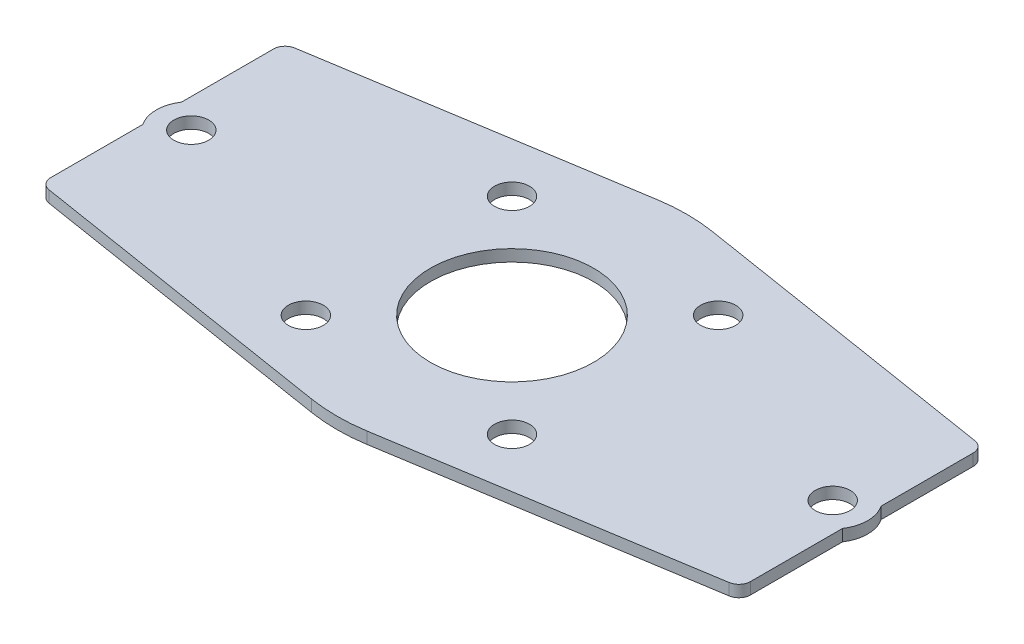
ISO-10303-21;
HEADER;
FILE_DESCRIPTION(('STEP AP214'),'2;1');
FILE_NAME('part.step','',(''),(''),'','','');
FILE_SCHEMA(('AUTOMOTIVE_DESIGN { 1 0 10303 214 1 1 1 1 }'));
ENDSEC;
DATA;
#1=APPLICATION_CONTEXT('core data for automotive mechanical design processes');
#2=APPLICATION_PROTOCOL_DEFINITION('international standard','automotive_design',2000,#1);
#3=PRODUCT_CONTEXT('',#1,'mechanical');
#4=PRODUCT('Part','Part','',(#3));
#5=PRODUCT_RELATED_PRODUCT_CATEGORY('part','',(#4));
#6=PRODUCT_DEFINITION_FORMATION('','',#4);
#7=PRODUCT_DEFINITION_CONTEXT('part definition',#1,'design');
#8=PRODUCT_DEFINITION('design','',#6,#7);
#9=PRODUCT_DEFINITION_SHAPE('','',#8);
#10=(LENGTH_UNIT() NAMED_UNIT(*) SI_UNIT(.MILLI.,.METRE.));
#11=(NAMED_UNIT(*) PLANE_ANGLE_UNIT() SI_UNIT($,.RADIAN.));
#12=(NAMED_UNIT(*) SI_UNIT($,.STERADIAN.) SOLID_ANGLE_UNIT());
#13=UNCERTAINTY_MEASURE_WITH_UNIT(LENGTH_MEASURE(1.E-05),#10,'distance_accuracy_value','');
#14=(GEOMETRIC_REPRESENTATION_CONTEXT(3) GLOBAL_UNCERTAINTY_ASSIGNED_CONTEXT((#13)) GLOBAL_UNIT_ASSIGNED_CONTEXT((#10,
#11,#12)) REPRESENTATION_CONTEXT('',''));
#15=CARTESIAN_POINT('',(0.,0.,0.));
#16=DIRECTION('',(0.,0.,1.));
#17=DIRECTION('',(1.,0.,0.));
#18=AXIS2_PLACEMENT_3D('',#15,#16,#17);
#19=CARTESIAN_POINT('',(0.,1.,0.));
#20=DIRECTION('',(0.,-1.,0.));
#21=DIRECTION('',(0.,0.,-1.));
#22=AXIS2_PLACEMENT_3D('',#19,#20,#21);
#23=CYLINDRICAL_SURFACE('',#22,15.);
#24=CARTESIAN_POINT('',(0.,0.,0.));
#25=DIRECTION('',(0.,1.,0.));
#26=DIRECTION('',(0.,0.,1.));
#27=AXIS2_PLACEMENT_3D('',#24,#25,#26);
#28=CIRCLE('',#27,15.);
#29=CARTESIAN_POINT('',(-2.36544142165045,0.,14.8123153787901));
#30=VERTEX_POINT('',#29);
#31=CARTESIAN_POINT('',(2.36544142165045,0.,14.8123153787901));
#32=VERTEX_POINT('',#31);
#33=EDGE_CURVE('E202',#30,#32,#28,.T.);
#34=ORIENTED_EDGE('',*,*,#33,.T.);
#35=DIRECTION('',(0.,-1.,0.));
#36=VECTOR('',#35,1.);
#37=CARTESIAN_POINT('',(2.36544142165045,1.,14.8123153787901));
#38=LINE('',#37,#36);
#39=CARTESIAN_POINT('',(2.36544142165045,1.,14.8123153787901));
#40=VERTEX_POINT('',#39);
#41=EDGE_CURVE('E11',#40,#32,#38,.T.);
#42=ORIENTED_EDGE('',*,*,#41,.F.);
#43=CARTESIAN_POINT('',(0.,1.,0.));
#44=DIRECTION('',(0.,1.,0.));
#45=DIRECTION('',(0.,0.,1.));
#46=AXIS2_PLACEMENT_3D('',#43,#44,#45);
#47=CIRCLE('',#46,15.);
#48=CARTESIAN_POINT('',(-2.36544142165045,1.,14.8123153787901));
#49=VERTEX_POINT('',#48);
#50=EDGE_CURVE('E116',#49,#40,#47,.T.);
#51=ORIENTED_EDGE('',*,*,#50,.F.);
#52=DIRECTION('',(0.,-1.,0.));
#53=VECTOR('',#52,1.);
#54=CARTESIAN_POINT('',(-2.36544142165045,1.,14.8123153787901));
#55=LINE('',#54,#53);
#56=EDGE_CURVE('E186',#49,#30,#55,.T.);
#57=ORIENTED_EDGE('',*,*,#56,.T.);
#58=EDGE_LOOP('',(#34,#42,#51,#57));
#59=FACE_BOUND('',#58,.T.);
#60=ADVANCED_FACE('F35',(#59),#23,.T.);
#61=CARTESIAN_POINT('',(2.36544142165045,1.,14.8123153787901));
#62=DIRECTION('',(0.157696094776696,0.,0.987487691919337));
#63=DIRECTION('',(0.987487691919337,0.,-0.157696094776696));
#64=AXIS2_PLACEMENT_3D('',#61,#62,#63);
#65=PLANE('',#64);
#66=DIRECTION('',(-0.987487691919337,0.,0.157696094776697));
#67=VECTOR('',#66,1.);
#68=CARTESIAN_POINT('',(2.36544142165045,0.,14.8123153787901));
#69=LINE('',#68,#67);
#70=CARTESIAN_POINT('',(29.1576960950391,0.,10.5337466767903));
#71=VERTEX_POINT('',#70);
#72=EDGE_CURVE('E205',#71,#32,#69,.T.);
#73=ORIENTED_EDGE('',*,*,#72,.F.);
#74=DIRECTION('',(0.,-1.,0.));
#75=VECTOR('',#74,1.);
#76=CARTESIAN_POINT('',(29.1576960950391,1.,10.5337466767903));
#77=LINE('',#76,#75);
#78=CARTESIAN_POINT('',(29.1576960950391,1.,10.5337466767903));
#79=VERTEX_POINT('',#78);
#80=EDGE_CURVE('E44',#79,#71,#77,.T.);
#81=ORIENTED_EDGE('',*,*,#80,.F.);
#82=DIRECTION('',(-0.987487691919337,0.,0.157696094776697));
#83=VECTOR('',#82,1.);
#84=CARTESIAN_POINT('',(2.36544142165045,1.,14.8123153787901));
#85=LINE('',#84,#83);
#86=EDGE_CURVE('E290',#79,#40,#85,.T.);
#87=ORIENTED_EDGE('',*,*,#86,.T.);
#88=ORIENTED_EDGE('',*,*,#41,.T.);
#89=EDGE_LOOP('',(#73,#81,#87,#88));
#90=FACE_BOUND('',#89,.T.);
#91=ADVANCED_FACE('F276',(#90),#65,.T.);
#92=CARTESIAN_POINT('',(29.0000000002624,1.,9.54625898487092));
#93=DIRECTION('',(0.,-1.,0.));
#94=DIRECTION('',(0.,0.,-1.));
#95=AXIS2_PLACEMENT_3D('',#92,#93,#94);
#96=CYLINDRICAL_SURFACE('',#95,1.);
#97=CARTESIAN_POINT('',(29.0000000002624,0.,9.54625898487092));
#98=DIRECTION('',(0.,1.,0.));
#99=DIRECTION('',(0.,0.,1.));
#100=AXIS2_PLACEMENT_3D('',#97,#98,#99);
#101=CIRCLE('',#100,1.);
#102=CARTESIAN_POINT('',(30.0000000002624,0.,9.54625898487092));
#103=VERTEX_POINT('',#102);
#104=EDGE_CURVE('E209',#103,#71,#101,.F.);
#105=ORIENTED_EDGE('',*,*,#104,.F.);
#106=DIRECTION('',(0.,-1.,0.));
#107=VECTOR('',#106,1.);
#108=CARTESIAN_POINT('',(30.0000000002624,1.,9.54625898487092));
#109=LINE('',#108,#107);
#110=CARTESIAN_POINT('',(30.0000000002624,1.,9.54625898487092));
#111=VERTEX_POINT('',#110);
#112=EDGE_CURVE('E266',#111,#103,#109,.T.);
#113=ORIENTED_EDGE('',*,*,#112,.F.);
#114=CARTESIAN_POINT('',(29.0000000002624,1.,9.54625898487092));
#115=DIRECTION('',(0.,1.,0.));
#116=DIRECTION('',(0.,0.,1.));
#117=AXIS2_PLACEMENT_3D('',#114,#115,#116);
#118=CIRCLE('',#117,1.);
#119=EDGE_CURVE('E273',#111,#79,#118,.F.);
#120=ORIENTED_EDGE('',*,*,#119,.T.);
#121=ORIENTED_EDGE('',*,*,#80,.T.);
#122=EDGE_LOOP('',(#105,#113,#120,#121));
#123=FACE_BOUND('',#122,.T.);
#124=ADVANCED_FACE('F271',(#123),#96,.T.);
#125=CARTESIAN_POINT('',(30.0000000002624,1.,0.));
#126=DIRECTION('',(1.,0.,0.));
#127=DIRECTION('',(0.,0.,-1.));
#128=AXIS2_PLACEMENT_3D('',#125,#126,#127);
#129=PLANE('',#128);
#130=DIRECTION('',(0.,0.,1.));
#131=VECTOR('',#130,1.);
#132=CARTESIAN_POINT('',(30.0000000002624,0.,0.));
#133=LINE('',#132,#131);
#134=CARTESIAN_POINT('',(30.0000000002624,0.,1.65831239478212));
#135=VERTEX_POINT('',#134);
#136=EDGE_CURVE('E212',#135,#103,#133,.T.);
#137=ORIENTED_EDGE('',*,*,#136,.F.);
#138=DIRECTION('',(0.,-1.,0.));
#139=VECTOR('',#138,1.);
#140=CARTESIAN_POINT('',(30.0000000002624,1.,1.65831239478212));
#141=LINE('',#140,#139);
#142=CARTESIAN_POINT('',(30.0000000002624,1.,1.65831239478212));
#143=VERTEX_POINT('',#142);
#144=EDGE_CURVE('E264',#143,#135,#141,.T.);
#145=ORIENTED_EDGE('',*,*,#144,.F.);
#146=DIRECTION('',(0.,0.,1.));
#147=VECTOR('',#146,1.);
#148=CARTESIAN_POINT('',(30.0000000002624,1.,0.));
#149=LINE('',#148,#147);
#150=EDGE_CURVE('E289',#143,#111,#149,.T.);
#151=ORIENTED_EDGE('',*,*,#150,.T.);
#152=ORIENTED_EDGE('',*,*,#112,.T.);
#153=EDGE_LOOP('',(#137,#145,#151,#152));
#154=FACE_BOUND('',#153,.T.);
#155=ADVANCED_FACE('F285',(#154),#129,.T.);
#156=CARTESIAN_POINT('',(27.5,1.,0.));
#157=DIRECTION('',(0.,-1.,0.));
#158=DIRECTION('',(0.,0.,-1.));
#159=AXIS2_PLACEMENT_3D('',#156,#157,#158);
#160=CYLINDRICAL_SURFACE('',#159,3.);
#161=CARTESIAN_POINT('',(27.5,0.,0.));
#162=DIRECTION('',(0.,1.,0.));
#163=DIRECTION('',(0.,0.,1.));
#164=AXIS2_PLACEMENT_3D('',#161,#162,#163);
#165=CIRCLE('',#164,3.);
#166=CARTESIAN_POINT('',(30.0000000002624,0.,-1.65831239478214));
#167=VERTEX_POINT('',#166);
#168=EDGE_CURVE('E215',#135,#167,#165,.T.);
#169=ORIENTED_EDGE('',*,*,#168,.T.);
#170=DIRECTION('',(0.,-1.,0.));
#171=VECTOR('',#170,1.);
#172=CARTESIAN_POINT('',(30.0000000002624,1.,-1.65831239478214));
#173=LINE('',#172,#171);
#174=CARTESIAN_POINT('',(30.0000000002624,1.,-1.65831239478214));
#175=VERTEX_POINT('',#174);
#176=EDGE_CURVE('E262',#175,#167,#173,.T.);
#177=ORIENTED_EDGE('',*,*,#176,.F.);
#178=CARTESIAN_POINT('',(27.5,1.,0.));
#179=DIRECTION('',(0.,1.,0.));
#180=DIRECTION('',(0.,0.,1.));
#181=AXIS2_PLACEMENT_3D('',#178,#179,#180);
#182=CIRCLE('',#181,3.);
#183=EDGE_CURVE('E292',#143,#175,#182,.T.);
#184=ORIENTED_EDGE('',*,*,#183,.F.);
#185=ORIENTED_EDGE('',*,*,#144,.T.);
#186=EDGE_LOOP('',(#169,#177,#184,#185));
#187=FACE_BOUND('',#186,.T.);
#188=ADVANCED_FACE('F437',(#187),#160,.T.);
#189=CARTESIAN_POINT('',(30.0000000002624,0.,-9.54625898487092));
#190=VERTEX_POINT('',#189);
#191=EDGE_CURVE('E216',#190,#167,#133,.T.);
#192=ORIENTED_EDGE('',*,*,#191,.F.);
#193=DIRECTION('',(0.,-1.,0.));
#194=VECTOR('',#193,1.);
#195=CARTESIAN_POINT('',(30.0000000002624,1.,-9.54625898487092));
#196=LINE('',#195,#194);
#197=CARTESIAN_POINT('',(30.0000000002624,1.,-9.54625898487092));
#198=VERTEX_POINT('',#197);
#199=EDGE_CURVE('E260',#198,#190,#196,.T.);
#200=ORIENTED_EDGE('',*,*,#199,.F.);
#201=EDGE_CURVE('E294',#198,#175,#149,.T.);
#202=ORIENTED_EDGE('',*,*,#201,.T.);
#203=ORIENTED_EDGE('',*,*,#176,.T.);
#204=EDGE_LOOP('',(#192,#200,#202,#203));
#205=FACE_BOUND('',#204,.T.);
#206=ADVANCED_FACE('F440',(#205),#129,.T.);
#207=CARTESIAN_POINT('',(29.0000000002624,1.,-9.54625898487092));
#208=DIRECTION('',(0.,-1.,0.));
#209=DIRECTION('',(0.,0.,-1.));
#210=AXIS2_PLACEMENT_3D('',#207,#208,#209);
#211=CYLINDRICAL_SURFACE('',#210,1.);
#212=CARTESIAN_POINT('',(29.0000000002624,0.,-9.54625898487092));
#213=DIRECTION('',(0.,1.,0.));
#214=DIRECTION('',(0.,0.,1.));
#215=AXIS2_PLACEMENT_3D('',#212,#213,#214);
#216=CIRCLE('',#215,1.);
#217=CARTESIAN_POINT('',(29.1576960950391,0.,-10.5337466767903));
#218=VERTEX_POINT('',#217);
#219=EDGE_CURVE('E219',#218,#190,#216,.F.);
#220=ORIENTED_EDGE('',*,*,#219,.F.);
#221=DIRECTION('',(0.,-1.,0.));
#222=VECTOR('',#221,1.);
#223=CARTESIAN_POINT('',(29.1576960950391,1.,-10.5337466767903));
#224=LINE('',#223,#222);
#225=CARTESIAN_POINT('',(29.1576960950391,1.,-10.5337466767903));
#226=VERTEX_POINT('',#225);
#227=EDGE_CURVE('E258',#226,#218,#224,.T.);
#228=ORIENTED_EDGE('',*,*,#227,.F.);
#229=CARTESIAN_POINT('',(29.0000000002624,1.,-9.54625898487092));
#230=DIRECTION('',(0.,1.,0.));
#231=DIRECTION('',(0.,0.,1.));
#232=AXIS2_PLACEMENT_3D('',#229,#230,#231);
#233=CIRCLE('',#232,1.);
#234=EDGE_CURVE('E299',#226,#198,#233,.F.);
#235=ORIENTED_EDGE('',*,*,#234,.T.);
#236=ORIENTED_EDGE('',*,*,#199,.T.);
#237=EDGE_LOOP('',(#220,#228,#235,#236));
#238=FACE_BOUND('',#237,.T.);
#239=ADVANCED_FACE('F355',(#238),#211,.T.);
#240=CARTESIAN_POINT('',(2.36544142165045,1.,-14.8123153787901));
#241=DIRECTION('',(-0.157696094776697,0.,0.987487691919337));
#242=DIRECTION('',(0.987487691919337,0.,0.157696094776697));
#243=AXIS2_PLACEMENT_3D('',#240,#241,#242);
#244=PLANE('',#243);
#245=DIRECTION('',(-0.987487691919337,0.,-0.157696094776697));
#246=VECTOR('',#245,1.);
#247=CARTESIAN_POINT('',(2.36544142165045,0.,-14.8123153787901));
#248=LINE('',#247,#246);
#249=CARTESIAN_POINT('',(2.36544142165045,0.,-14.8123153787901));
#250=VERTEX_POINT('',#249);
#251=EDGE_CURVE('E222',#218,#250,#248,.T.);
#252=ORIENTED_EDGE('',*,*,#251,.T.);
#253=DIRECTION('',(0.,-1.,0.));
#254=VECTOR('',#253,1.);
#255=CARTESIAN_POINT('',(2.36544142165045,1.,-14.8123153787901));
#256=LINE('',#255,#254);
#257=CARTESIAN_POINT('',(2.36544142165045,1.,-14.8123153787901));
#258=VERTEX_POINT('',#257);
#259=EDGE_CURVE('E255',#258,#250,#256,.T.);
#260=ORIENTED_EDGE('',*,*,#259,.F.);
#261=DIRECTION('',(-0.987487691919337,0.,-0.157696094776697));
#262=VECTOR('',#261,1.);
#263=CARTESIAN_POINT('',(2.36544142165045,1.,-14.8123153787901));
#264=LINE('',#263,#262);
#265=EDGE_CURVE('E302',#226,#258,#264,.T.);
#266=ORIENTED_EDGE('',*,*,#265,.F.);
#267=ORIENTED_EDGE('',*,*,#227,.T.);
#268=EDGE_LOOP('',(#252,#260,#266,#267));
#269=FACE_BOUND('',#268,.T.);
#270=ADVANCED_FACE('F347',(#269),#244,.F.);
#271=CARTESIAN_POINT('',(-2.36544142165045,0.,-14.8123153787901));
#272=VERTEX_POINT('',#271);
#273=EDGE_CURVE('E206',#250,#272,#28,.T.);
#274=ORIENTED_EDGE('',*,*,#273,.T.);
#275=DIRECTION('',(0.,-1.,0.));
#276=VECTOR('',#275,1.);
#277=CARTESIAN_POINT('',(-2.36544142165045,1.,-14.8123153787901));
#278=LINE('',#277,#276);
#279=CARTESIAN_POINT('',(-2.36544142165045,1.,-14.8123153787901));
#280=VERTEX_POINT('',#279);
#281=EDGE_CURVE('E253',#280,#272,#278,.T.);
#282=ORIENTED_EDGE('',*,*,#281,.F.);
#283=EDGE_CURVE('E304',#258,#280,#47,.T.);
#284=ORIENTED_EDGE('',*,*,#283,.F.);
#285=ORIENTED_EDGE('',*,*,#259,.T.);
#286=EDGE_LOOP('',(#274,#282,#284,#285));
#287=FACE_BOUND('',#286,.T.);
#288=ADVANCED_FACE('F338',(#287),#23,.T.);
#289=CARTESIAN_POINT('',(-2.36544142165045,1.,-14.8123153787901));
#290=DIRECTION('',(-0.157696094776697,0.,-0.987487691919337));
#291=DIRECTION('',(-0.987487691919337,0.,0.157696094776697));
#292=AXIS2_PLACEMENT_3D('',#289,#290,#291);
#293=PLANE('',#292);
#294=DIRECTION('',(0.987487691919337,0.,-0.157696094776697));
#295=VECTOR('',#294,1.);
#296=CARTESIAN_POINT('',(-2.36544142165045,0.,-14.8123153787901));
#297=LINE('',#296,#295);
#298=CARTESIAN_POINT('',(-29.1576960950391,0.,-10.5337466767903));
#299=VERTEX_POINT('',#298);
#300=EDGE_CURVE('E224',#299,#272,#297,.T.);
#301=ORIENTED_EDGE('',*,*,#300,.F.);
#302=DIRECTION('',(0.,-1.,0.));
#303=VECTOR('',#302,1.);
#304=CARTESIAN_POINT('',(-29.1576960950391,1.,-10.5337466767903));
#305=LINE('',#304,#303);
#306=CARTESIAN_POINT('',(-29.1576960950391,1.,-10.5337466767903));
#307=VERTEX_POINT('',#306);
#308=EDGE_CURVE('E251',#307,#299,#305,.T.);
#309=ORIENTED_EDGE('',*,*,#308,.F.);
#310=DIRECTION('',(0.987487691919337,0.,-0.157696094776697));
#311=VECTOR('',#310,1.);
#312=CARTESIAN_POINT('',(-2.36544142165045,1.,-14.8123153787901));
#313=LINE('',#312,#311);
#314=EDGE_CURVE('E305',#307,#280,#313,.T.);
#315=ORIENTED_EDGE('',*,*,#314,.T.);
#316=ORIENTED_EDGE('',*,*,#281,.T.);
#317=EDGE_LOOP('',(#301,#309,#315,#316));
#318=FACE_BOUND('',#317,.T.);
#319=ADVANCED_FACE('F346',(#318),#293,.T.);
#320=CARTESIAN_POINT('',(-29.0000000002624,1.,-9.54625898487092));
#321=DIRECTION('',(0.,-1.,0.));
#322=DIRECTION('',(0.,0.,-1.));
#323=AXIS2_PLACEMENT_3D('',#320,#321,#322);
#324=CYLINDRICAL_SURFACE('',#323,1.);
#325=CARTESIAN_POINT('',(-29.0000000002624,0.,-9.54625898487092));
#326=DIRECTION('',(0.,1.,0.));
#327=DIRECTION('',(0.,0.,1.));
#328=AXIS2_PLACEMENT_3D('',#325,#326,#327);
#329=CIRCLE('',#328,1.);
#330=CARTESIAN_POINT('',(-30.0000000002624,0.,-9.54625898487092));
#331=VERTEX_POINT('',#330);
#332=EDGE_CURVE('E227',#299,#331,#329,.T.);
#333=ORIENTED_EDGE('',*,*,#332,.T.);
#334=DIRECTION('',(0.,-1.,0.));
#335=VECTOR('',#334,1.);
#336=CARTESIAN_POINT('',(-30.0000000002624,1.,-9.54625898487092));
#337=LINE('',#336,#335);
#338=CARTESIAN_POINT('',(-30.0000000002624,1.,-9.54625898487092));
#339=VERTEX_POINT('',#338);
#340=EDGE_CURVE('E248',#339,#331,#337,.T.);
#341=ORIENTED_EDGE('',*,*,#340,.F.);
#342=CARTESIAN_POINT('',(-29.0000000002624,1.,-9.54625898487092));
#343=DIRECTION('',(0.,1.,0.));
#344=DIRECTION('',(0.,0.,1.));
#345=AXIS2_PLACEMENT_3D('',#342,#343,#344);
#346=CIRCLE('',#345,1.);
#347=EDGE_CURVE('E308',#307,#339,#346,.T.);
#348=ORIENTED_EDGE('',*,*,#347,.F.);
#349=ORIENTED_EDGE('',*,*,#308,.T.);
#350=EDGE_LOOP('',(#333,#341,#348,#349));
#351=FACE_BOUND('',#350,.T.);
#352=ADVANCED_FACE('F353',(#351),#324,.T.);
#353=CARTESIAN_POINT('',(-30.0000000002624,1.,0.));
#354=DIRECTION('',(1.,0.,0.));
#355=DIRECTION('',(0.,0.,-1.));
#356=AXIS2_PLACEMENT_3D('',#353,#354,#355);
#357=PLANE('',#356);
#358=DIRECTION('',(0.,0.,1.));
#359=VECTOR('',#358,1.);
#360=CARTESIAN_POINT('',(-30.0000000002624,0.,0.));
#361=LINE('',#360,#359);
#362=CARTESIAN_POINT('',(-30.0000000002624,0.,-1.65831239478213));
#363=VERTEX_POINT('',#362);
#364=EDGE_CURVE('E229',#331,#363,#361,.T.);
#365=ORIENTED_EDGE('',*,*,#364,.T.);
#366=DIRECTION('',(0.,-1.,0.));
#367=VECTOR('',#366,1.);
#368=CARTESIAN_POINT('',(-30.0000000002624,1.,-1.65831239478213));
#369=LINE('',#368,#367);
#370=CARTESIAN_POINT('',(-30.0000000002624,1.,-1.65831239478213));
#371=VERTEX_POINT('',#370);
#372=EDGE_CURVE('E245',#371,#363,#369,.T.);
#373=ORIENTED_EDGE('',*,*,#372,.F.);
#374=DIRECTION('',(0.,0.,1.));
#375=VECTOR('',#374,1.);
#376=CARTESIAN_POINT('',(-30.0000000002624,1.,0.));
#377=LINE('',#376,#375);
#378=EDGE_CURVE('E167',#339,#371,#377,.T.);
#379=ORIENTED_EDGE('',*,*,#378,.F.);
#380=ORIENTED_EDGE('',*,*,#340,.T.);
#381=EDGE_LOOP('',(#365,#373,#379,#380));
#382=FACE_BOUND('',#381,.T.);
#383=ADVANCED_FACE('F315',(#382),#357,.F.);
#384=CARTESIAN_POINT('',(-27.5,1.,0.));
#385=DIRECTION('',(0.,-1.,0.));
#386=DIRECTION('',(0.,0.,-1.));
#387=AXIS2_PLACEMENT_3D('',#384,#385,#386);
#388=CYLINDRICAL_SURFACE('',#387,3.);
#389=CARTESIAN_POINT('',(-27.5,0.,0.));
#390=DIRECTION('',(0.,1.,0.));
#391=DIRECTION('',(0.,0.,1.));
#392=AXIS2_PLACEMENT_3D('',#389,#390,#391);
#393=CIRCLE('',#392,3.);
#394=CARTESIAN_POINT('',(-30.0000000002624,0.,1.65831239478213));
#395=VERTEX_POINT('',#394);
#396=EDGE_CURVE('E231',#363,#395,#393,.T.);
#397=ORIENTED_EDGE('',*,*,#396,.T.);
#398=DIRECTION('',(0.,-1.,0.));
#399=VECTOR('',#398,1.);
#400=CARTESIAN_POINT('',(-30.0000000002624,1.,1.65831239478213));
#401=LINE('',#400,#399);
#402=CARTESIAN_POINT('',(-30.0000000002624,1.,1.65831239478213));
#403=VERTEX_POINT('',#402);
#404=EDGE_CURVE('E172',#403,#395,#401,.T.);
#405=ORIENTED_EDGE('',*,*,#404,.F.);
#406=CARTESIAN_POINT('',(-27.5,1.,0.));
#407=DIRECTION('',(0.,1.,0.));
#408=DIRECTION('',(0.,0.,1.));
#409=AXIS2_PLACEMENT_3D('',#406,#407,#408);
#410=CIRCLE('',#409,3.);
#411=EDGE_CURVE('E162',#371,#403,#410,.T.);
#412=ORIENTED_EDGE('',*,*,#411,.F.);
#413=ORIENTED_EDGE('',*,*,#372,.T.);
#414=EDGE_LOOP('',(#397,#405,#412,#413));
#415=FACE_BOUND('',#414,.T.);
#416=ADVANCED_FACE('F319',(#415),#388,.T.);
#417=CARTESIAN_POINT('',(-30.0000000002624,0.,9.54625898487092));
#418=VERTEX_POINT('',#417);
#419=EDGE_CURVE('E171',#395,#418,#361,.T.);
#420=ORIENTED_EDGE('',*,*,#419,.T.);
#421=DIRECTION('',(0.,-1.,0.));
#422=VECTOR('',#421,1.);
#423=CARTESIAN_POINT('',(-30.0000000002624,1.,9.54625898487092));
#424=LINE('',#423,#422);
#425=CARTESIAN_POINT('',(-30.0000000002624,1.,9.54625898487092));
#426=VERTEX_POINT('',#425);
#427=EDGE_CURVE('E168',#426,#418,#424,.T.);
#428=ORIENTED_EDGE('',*,*,#427,.F.);
#429=EDGE_CURVE('E155',#403,#426,#377,.T.);
#430=ORIENTED_EDGE('',*,*,#429,.F.);
#431=ORIENTED_EDGE('',*,*,#404,.T.);
#432=EDGE_LOOP('',(#420,#428,#430,#431));
#433=FACE_BOUND('',#432,.T.);
#434=ADVANCED_FACE('F169',(#433),#357,.F.);
#435=CARTESIAN_POINT('',(-29.0000000002624,1.,9.54625898487092));
#436=DIRECTION('',(0.,-1.,0.));
#437=DIRECTION('',(0.,0.,-1.));
#438=AXIS2_PLACEMENT_3D('',#435,#436,#437);
#439=CYLINDRICAL_SURFACE('',#438,1.);
#440=CARTESIAN_POINT('',(-29.0000000002624,0.,9.54625898487092));
#441=DIRECTION('',(0.,1.,0.));
#442=DIRECTION('',(0.,0.,1.));
#443=AXIS2_PLACEMENT_3D('',#440,#441,#442);
#444=CIRCLE('',#443,1.);
#445=CARTESIAN_POINT('',(-29.1576960950391,0.,10.5337466767903));
#446=VERTEX_POINT('',#445);
#447=EDGE_CURVE('E104',#418,#446,#444,.T.);
#448=ORIENTED_EDGE('',*,*,#447,.T.);
#449=DIRECTION('',(0.,-1.,0.));
#450=VECTOR('',#449,1.);
#451=CARTESIAN_POINT('',(-29.1576960950391,1.,10.5337466767903));
#452=LINE('',#451,#450);
#453=CARTESIAN_POINT('',(-29.1576960950391,1.,10.5337466767903));
#454=VERTEX_POINT('',#453);
#455=EDGE_CURVE('E173',#454,#446,#452,.T.);
#456=ORIENTED_EDGE('',*,*,#455,.F.);
#457=CARTESIAN_POINT('',(-29.0000000002624,1.,9.54625898487092));
#458=DIRECTION('',(0.,1.,0.));
#459=DIRECTION('',(0.,0.,1.));
#460=AXIS2_PLACEMENT_3D('',#457,#458,#459);
#461=CIRCLE('',#460,1.);
#462=EDGE_CURVE('E160',#426,#454,#461,.T.);
#463=ORIENTED_EDGE('',*,*,#462,.F.);
#464=ORIENTED_EDGE('',*,*,#427,.T.);
#465=EDGE_LOOP('',(#448,#456,#463,#464));
#466=FACE_BOUND('',#465,.T.);
#467=ADVANCED_FACE('F175',(#466),#439,.T.);
#468=CARTESIAN_POINT('',(27.5,1.,0.));
#469=DIRECTION('',(0.,-1.,0.));
#470=DIRECTION('',(0.,0.,-1.));
#471=AXIS2_PLACEMENT_3D('',#468,#469,#470);
#472=CYLINDRICAL_SURFACE('',#471,1.5);
#473=CARTESIAN_POINT('',(27.5,1.,0.));
#474=DIRECTION('',(0.,1.,0.));
#475=DIRECTION('',(0.,0.,1.));
#476=AXIS2_PLACEMENT_3D('',#473,#474,#475);
#477=CIRCLE('',#476,1.5);
#478=CARTESIAN_POINT('',(27.5,1.,1.49999999999999));
#479=VERTEX_POINT('',#478);
#480=EDGE_CURVE('E177',#479,#479,#477,.T.);
#481=ORIENTED_EDGE('',*,*,#480,.T.);
#482=EDGE_LOOP('',(#481));
#483=FACE_BOUND('',#482,.T.);
#484=CARTESIAN_POINT('',(27.5,0.,0.));
#485=DIRECTION('',(0.,1.,0.));
#486=DIRECTION('',(0.,0.,1.));
#487=AXIS2_PLACEMENT_3D('',#484,#485,#486);
#488=CIRCLE('',#487,1.5);
#489=CARTESIAN_POINT('',(27.5,0.,1.49999999999999));
#490=VERTEX_POINT('',#489);
#491=EDGE_CURVE('E235',#490,#490,#488,.T.);
#492=ORIENTED_EDGE('',*,*,#491,.F.);
#493=EDGE_LOOP('',(#492));
#494=FACE_BOUND('',#493,.T.);
#495=ADVANCED_FACE('F324',(#483,#494),#472,.F.);
#496=CARTESIAN_POINT('',(-2.36544142165045,1.,14.8123153787901));
#497=DIRECTION('',(0.157696094776697,0.,-0.987487691919337));
#498=DIRECTION('',(-0.987487691919337,0.,-0.157696094776697));
#499=AXIS2_PLACEMENT_3D('',#496,#497,#498);
#500=PLANE('',#499);
#501=DIRECTION('',(0.987487691919337,0.,0.157696094776697));
#502=VECTOR('',#501,1.);
#503=CARTESIAN_POINT('',(-2.36544142165045,0.,14.8123153787901));
#504=LINE('',#503,#502);
#505=EDGE_CURVE('E110',#446,#30,#504,.T.);
#506=ORIENTED_EDGE('',*,*,#505,.T.);
#507=ORIENTED_EDGE('',*,*,#56,.F.);
#508=DIRECTION('',(0.987487691919337,0.,0.157696094776697));
#509=VECTOR('',#508,1.);
#510=CARTESIAN_POINT('',(-2.36544142165045,1.,14.8123153787901));
#511=LINE('',#510,#509);
#512=EDGE_CURVE('E52',#454,#49,#511,.T.);
#513=ORIENTED_EDGE('',*,*,#512,.F.);
#514=ORIENTED_EDGE('',*,*,#455,.T.);
#515=EDGE_LOOP('',(#506,#507,#513,#514));
#516=FACE_BOUND('',#515,.T.);
#517=ADVANCED_FACE('F321',(#516),#500,.F.);
#518=CARTESIAN_POINT('',(0.,1.,0.));
#519=DIRECTION('',(0.,-1.,0.));
#520=DIRECTION('',(0.,0.,-1.));
#521=AXIS2_PLACEMENT_3D('',#518,#519,#520);
#522=CYLINDRICAL_SURFACE('',#521,7.);
#523=CARTESIAN_POINT('',(0.,1.,0.));
#524=DIRECTION('',(0.,1.,0.));
#525=DIRECTION('',(0.,0.,1.));
#526=AXIS2_PLACEMENT_3D('',#523,#524,#525);
#527=CIRCLE('',#526,7.);
#528=CARTESIAN_POINT('',(0.,1.,7.));
#529=VERTEX_POINT('',#528);
#530=EDGE_CURVE('E368',#529,#529,#527,.T.);
#531=ORIENTED_EDGE('',*,*,#530,.T.);
#532=EDGE_LOOP('',(#531));
#533=FACE_BOUND('',#532,.T.);
#534=CARTESIAN_POINT('',(0.,0.,0.));
#535=DIRECTION('',(0.,1.,0.));
#536=DIRECTION('',(0.,0.,1.));
#537=AXIS2_PLACEMENT_3D('',#534,#535,#536);
#538=CIRCLE('',#537,7.);
#539=CARTESIAN_POINT('',(0.,0.,7.));
#540=VERTEX_POINT('',#539);
#541=EDGE_CURVE('E199',#540,#540,#538,.T.);
#542=ORIENTED_EDGE('',*,*,#541,.F.);
#543=EDGE_LOOP('',(#542));
#544=FACE_BOUND('',#543,.T.);
#545=ADVANCED_FACE('F323',(#533,#544),#522,.F.);
#546=CARTESIAN_POINT('',(-8.83883476483148,1.,8.83883476483221));
#547=DIRECTION('',(0.,-1.,0.));
#548=DIRECTION('',(0.,0.,-1.));
#549=AXIS2_PLACEMENT_3D('',#546,#547,#548);
#550=CYLINDRICAL_SURFACE('',#549,1.50000000000101);
#551=CARTESIAN_POINT('',(-8.83883476483148,1.,8.83883476483221));
#552=DIRECTION('',(0.,1.,0.));
#553=DIRECTION('',(0.,0.,1.));
#554=AXIS2_PLACEMENT_3D('',#551,#552,#553);
#555=CIRCLE('',#554,1.50000000000101);
#556=CARTESIAN_POINT('',(-8.83883476483148,1.,10.3388347648332));
#557=VERTEX_POINT('',#556);
#558=EDGE_CURVE('E370',#557,#557,#555,.T.);
#559=ORIENTED_EDGE('',*,*,#558,.T.);
#560=EDGE_LOOP('',(#559));
#561=FACE_BOUND('',#560,.T.);
#562=CARTESIAN_POINT('',(-8.83883476483148,0.,8.83883476483221));
#563=DIRECTION('',(0.,1.,0.));
#564=DIRECTION('',(0.,0.,1.));
#565=AXIS2_PLACEMENT_3D('',#562,#563,#564);
#566=CIRCLE('',#565,1.50000000000101);
#567=CARTESIAN_POINT('',(-8.83883476483148,0.,10.3388347648332));
#568=VERTEX_POINT('',#567);
#569=EDGE_CURVE('E196',#568,#568,#566,.T.);
#570=ORIENTED_EDGE('',*,*,#569,.F.);
#571=EDGE_LOOP('',(#570));
#572=FACE_BOUND('',#571,.T.);
#573=ADVANCED_FACE('F330',(#561,#572),#550,.F.);
#574=CARTESIAN_POINT('',(8.83883476483257,1.,8.83883476483183));
#575=DIRECTION('',(0.,-1.,0.));
#576=DIRECTION('',(0.,0.,-1.));
#577=AXIS2_PLACEMENT_3D('',#574,#575,#576);
#578=CYLINDRICAL_SURFACE('',#577,1.50000000000071);
#579=CARTESIAN_POINT('',(8.83883476483257,1.,8.83883476483183));
#580=DIRECTION('',(0.,1.,0.));
#581=DIRECTION('',(0.,0.,1.));
#582=AXIS2_PLACEMENT_3D('',#579,#580,#581);
#583=CIRCLE('',#582,1.50000000000071);
#584=CARTESIAN_POINT('',(8.83883476483257,1.,10.3388347648325));
#585=VERTEX_POINT('',#584);
#586=EDGE_CURVE('E373',#585,#585,#583,.T.);
#587=ORIENTED_EDGE('',*,*,#586,.T.);
#588=EDGE_LOOP('',(#587));
#589=FACE_BOUND('',#588,.T.);
#590=CARTESIAN_POINT('',(8.83883476483257,0.,8.83883476483183));
#591=DIRECTION('',(0.,1.,0.));
#592=DIRECTION('',(0.,0.,1.));
#593=AXIS2_PLACEMENT_3D('',#590,#591,#592);
#594=CIRCLE('',#593,1.50000000000071);
#595=CARTESIAN_POINT('',(8.83883476483257,0.,10.3388347648325));
#596=VERTEX_POINT('',#595);
#597=EDGE_CURVE('E193',#596,#596,#594,.T.);
#598=ORIENTED_EDGE('',*,*,#597,.F.);
#599=EDGE_LOOP('',(#598));
#600=FACE_BOUND('',#599,.T.);
#601=ADVANCED_FACE('F399',(#589,#600),#578,.F.);
#602=CARTESIAN_POINT('',(8.83883476483218,1.,-8.83883476483221));
#603=DIRECTION('',(0.,-1.,0.));
#604=DIRECTION('',(0.,0.,-1.));
#605=AXIS2_PLACEMENT_3D('',#602,#603,#604);
#606=CYLINDRICAL_SURFACE('',#605,1.50000000000046);
#607=CARTESIAN_POINT('',(8.83883476483218,1.,-8.83883476483221));
#608=DIRECTION('',(0.,1.,0.));
#609=DIRECTION('',(0.,0.,1.));
#610=AXIS2_PLACEMENT_3D('',#607,#608,#609);
#611=CIRCLE('',#610,1.50000000000046);
#612=CARTESIAN_POINT('',(8.83883476483218,1.,-7.33883476483175));
#613=VERTEX_POINT('',#612);
#614=EDGE_CURVE('E378',#613,#613,#611,.T.);
#615=ORIENTED_EDGE('',*,*,#614,.T.);
#616=EDGE_LOOP('',(#615));
#617=FACE_BOUND('',#616,.T.);
#618=CARTESIAN_POINT('',(8.83883476483218,0.,-8.83883476483221));
#619=DIRECTION('',(0.,1.,0.));
#620=DIRECTION('',(0.,0.,1.));
#621=AXIS2_PLACEMENT_3D('',#618,#619,#620);
#622=CIRCLE('',#621,1.50000000000046);
#623=CARTESIAN_POINT('',(8.83883476483218,0.,-7.33883476483175));
#624=VERTEX_POINT('',#623);
#625=EDGE_CURVE('E190',#624,#624,#622,.T.);
#626=ORIENTED_EDGE('',*,*,#625,.F.);
#627=EDGE_LOOP('',(#626));
#628=FACE_BOUND('',#627,.T.);
#629=ADVANCED_FACE('F418',(#617,#628),#606,.F.);
#630=CARTESIAN_POINT('',(-8.83883476483186,1.,-8.83883476483183));
#631=DIRECTION('',(0.,-1.,0.));
#632=DIRECTION('',(0.,0.,-1.));
#633=AXIS2_PLACEMENT_3D('',#630,#631,#632);
#634=CYLINDRICAL_SURFACE('',#633,1.50000000000076);
#635=CARTESIAN_POINT('',(-8.83883476483186,1.,-8.83883476483183));
#636=DIRECTION('',(0.,1.,0.));
#637=DIRECTION('',(0.,0.,1.));
#638=AXIS2_PLACEMENT_3D('',#635,#636,#637);
#639=CIRCLE('',#638,1.50000000000076);
#640=CARTESIAN_POINT('',(-8.83883476483186,1.,-7.33883476483107));
#641=VERTEX_POINT('',#640);
#642=EDGE_CURVE('E241',#641,#641,#639,.T.);
#643=ORIENTED_EDGE('',*,*,#642,.T.);
#644=EDGE_LOOP('',(#643));
#645=FACE_BOUND('',#644,.T.);
#646=CARTESIAN_POINT('',(-8.83883476483186,0.,-8.83883476483183));
#647=DIRECTION('',(0.,1.,0.));
#648=DIRECTION('',(0.,0.,1.));
#649=AXIS2_PLACEMENT_3D('',#646,#647,#648);
#650=CIRCLE('',#649,1.50000000000076);
#651=CARTESIAN_POINT('',(-8.83883476483186,0.,-7.33883476483107));
#652=VERTEX_POINT('',#651);
#653=EDGE_CURVE('E187',#652,#652,#650,.T.);
#654=ORIENTED_EDGE('',*,*,#653,.F.);
#655=EDGE_LOOP('',(#654));
#656=FACE_BOUND('',#655,.T.);
#657=ADVANCED_FACE('F37',(#645,#656),#634,.F.);
#658=CARTESIAN_POINT('',(-27.5,1.,0.));
#659=DIRECTION('',(0.,-1.,0.));
#660=DIRECTION('',(0.,0.,-1.));
#661=AXIS2_PLACEMENT_3D('',#658,#659,#660);
#662=CYLINDRICAL_SURFACE('',#661,1.5);
#663=CARTESIAN_POINT('',(-27.5,1.,0.));
#664=DIRECTION('',(0.,1.,0.));
#665=DIRECTION('',(0.,0.,1.));
#666=AXIS2_PLACEMENT_3D('',#663,#664,#665);
#667=CIRCLE('',#666,1.5);
#668=CARTESIAN_POINT('',(-27.5,1.,1.5));
#669=VERTEX_POINT('',#668);
#670=EDGE_CURVE('E183',#669,#669,#667,.T.);
#671=ORIENTED_EDGE('',*,*,#670,.T.);
#672=EDGE_LOOP('',(#671));
#673=FACE_BOUND('',#672,.T.);
#674=CARTESIAN_POINT('',(-27.5,0.,0.));
#675=DIRECTION('',(0.,1.,0.));
#676=DIRECTION('',(0.,0.,1.));
#677=AXIS2_PLACEMENT_3D('',#674,#675,#676);
#678=CIRCLE('',#677,1.5);
#679=CARTESIAN_POINT('',(-27.5,0.,1.5));
#680=VERTEX_POINT('',#679);
#681=EDGE_CURVE('E238',#680,#680,#678,.T.);
#682=ORIENTED_EDGE('',*,*,#681,.F.);
#683=EDGE_LOOP('',(#682));
#684=FACE_BOUND('',#683,.T.);
#685=ADVANCED_FACE('F388',(#673,#684),#662,.F.);
#686=CARTESIAN_POINT('',(0.,1.,0.));
#687=DIRECTION('',(0.,1.,0.));
#688=DIRECTION('',(0.,0.,1.));
#689=AXIS2_PLACEMENT_3D('',#686,#687,#688);
#690=PLANE('',#689);
#691=ORIENTED_EDGE('',*,*,#642,.F.);
#692=EDGE_LOOP('',(#691));
#693=FACE_BOUND('',#692,.T.);
#694=ORIENTED_EDGE('',*,*,#614,.F.);
#695=EDGE_LOOP('',(#694));
#696=FACE_BOUND('',#695,.T.);
#697=ORIENTED_EDGE('',*,*,#586,.F.);
#698=EDGE_LOOP('',(#697));
#699=FACE_BOUND('',#698,.T.);
#700=ORIENTED_EDGE('',*,*,#558,.F.);
#701=EDGE_LOOP('',(#700));
#702=FACE_BOUND('',#701,.T.);
#703=ORIENTED_EDGE('',*,*,#530,.F.);
#704=EDGE_LOOP('',(#703));
#705=FACE_BOUND('',#704,.T.);
#706=ORIENTED_EDGE('',*,*,#50,.T.);
#707=ORIENTED_EDGE('',*,*,#86,.F.);
#708=ORIENTED_EDGE('',*,*,#119,.F.);
#709=ORIENTED_EDGE('',*,*,#150,.F.);
#710=ORIENTED_EDGE('',*,*,#183,.T.);
#711=ORIENTED_EDGE('',*,*,#201,.F.);
#712=ORIENTED_EDGE('',*,*,#234,.F.);
#713=ORIENTED_EDGE('',*,*,#265,.T.);
#714=ORIENTED_EDGE('',*,*,#283,.T.);
#715=ORIENTED_EDGE('',*,*,#314,.F.);
#716=ORIENTED_EDGE('',*,*,#347,.T.);
#717=ORIENTED_EDGE('',*,*,#378,.T.);
#718=ORIENTED_EDGE('',*,*,#411,.T.);
#719=ORIENTED_EDGE('',*,*,#429,.T.);
#720=ORIENTED_EDGE('',*,*,#462,.T.);
#721=ORIENTED_EDGE('',*,*,#512,.T.);
#722=EDGE_LOOP('',(#706,#707,#708,#709,#710,#711,#712,#713,#714,#715,#716,#717,#718,#719,#720,#721));
#723=FACE_BOUND('',#722,.T.);
#724=ORIENTED_EDGE('',*,*,#480,.F.);
#725=EDGE_LOOP('',(#724));
#726=FACE_BOUND('',#725,.T.);
#727=ORIENTED_EDGE('',*,*,#670,.F.);
#728=EDGE_LOOP('',(#727));
#729=FACE_BOUND('',#728,.T.);
#730=ADVANCED_FACE('F157',(#693,#696,#699,#702,#705,#723,#726,#729),#690,.T.);
#731=CARTESIAN_POINT('',(0.,0.,0.));
#732=DIRECTION('',(0.,1.,0.));
#733=DIRECTION('',(0.,0.,1.));
#734=AXIS2_PLACEMENT_3D('',#731,#732,#733);
#735=PLANE('',#734);
#736=ORIENTED_EDGE('',*,*,#653,.T.);
#737=EDGE_LOOP('',(#736));
#738=FACE_BOUND('',#737,.T.);
#739=ORIENTED_EDGE('',*,*,#625,.T.);
#740=EDGE_LOOP('',(#739));
#741=FACE_BOUND('',#740,.T.);
#742=ORIENTED_EDGE('',*,*,#597,.T.);
#743=EDGE_LOOP('',(#742));
#744=FACE_BOUND('',#743,.T.);
#745=ORIENTED_EDGE('',*,*,#569,.T.);
#746=EDGE_LOOP('',(#745));
#747=FACE_BOUND('',#746,.T.);
#748=ORIENTED_EDGE('',*,*,#541,.T.);
#749=EDGE_LOOP('',(#748));
#750=FACE_BOUND('',#749,.T.);
#751=ORIENTED_EDGE('',*,*,#33,.F.);
#752=ORIENTED_EDGE('',*,*,#505,.F.);
#753=ORIENTED_EDGE('',*,*,#447,.F.);
#754=ORIENTED_EDGE('',*,*,#419,.F.);
#755=ORIENTED_EDGE('',*,*,#396,.F.);
#756=ORIENTED_EDGE('',*,*,#364,.F.);
#757=ORIENTED_EDGE('',*,*,#332,.F.);
#758=ORIENTED_EDGE('',*,*,#300,.T.);
#759=ORIENTED_EDGE('',*,*,#273,.F.);
#760=ORIENTED_EDGE('',*,*,#251,.F.);
#761=ORIENTED_EDGE('',*,*,#219,.T.);
#762=ORIENTED_EDGE('',*,*,#191,.T.);
#763=ORIENTED_EDGE('',*,*,#168,.F.);
#764=ORIENTED_EDGE('',*,*,#136,.T.);
#765=ORIENTED_EDGE('',*,*,#104,.T.);
#766=ORIENTED_EDGE('',*,*,#72,.T.);
#767=EDGE_LOOP('',(#751,#752,#753,#754,#755,#756,#757,#758,#759,#760,#761,#762,#763,#764,#765,#766));
#768=FACE_BOUND('',#767,.T.);
#769=ORIENTED_EDGE('',*,*,#491,.T.);
#770=EDGE_LOOP('',(#769));
#771=FACE_BOUND('',#770,.T.);
#772=ORIENTED_EDGE('',*,*,#681,.T.);
#773=EDGE_LOOP('',(#772));
#774=FACE_BOUND('',#773,.T.);
#775=ADVANCED_FACE('F279',(#738,#741,#744,#747,#750,#768,#771,#774),#735,.F.);
#776=CLOSED_SHELL('',(#60,#91,#124,#155,#188,#206,#239,#270,#288,#319,#352,#383,#416,#434,#467,
#495,#517,#545,#573,#601,#629,#657,#685,#730,#775));
#777=MANIFOLD_SOLID_BREP('B2',#776);
#778=ADVANCED_BREP_SHAPE_REPRESENTATION('',(#18,#777),#14);
#779=SHAPE_DEFINITION_REPRESENTATION(#9,#778);
ENDSEC;
END-ISO-10303-21;
